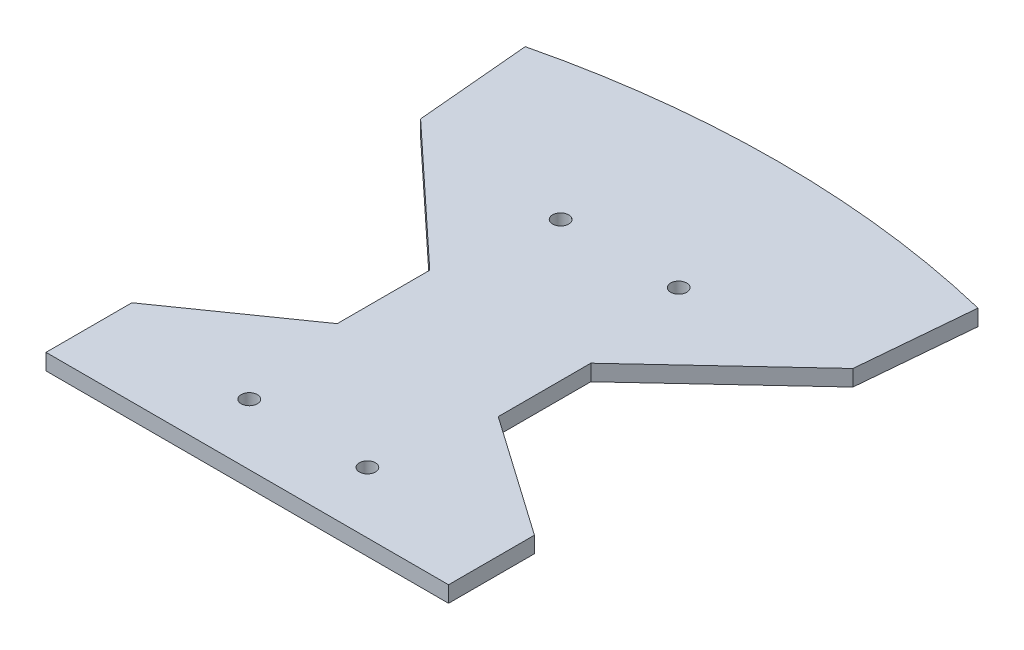
ISO-10303-21;
HEADER;
FILE_DESCRIPTION(('STEP AP214'),'2;1');
FILE_NAME('part.step','',(''),(''),'','','');
FILE_SCHEMA(('AUTOMOTIVE_DESIGN { 1 0 10303 214 1 1 1 1 }'));
ENDSEC;
DATA;
#1=APPLICATION_CONTEXT('core data for automotive mechanical design processes');
#2=APPLICATION_PROTOCOL_DEFINITION('international standard','automotive_design',2000,#1);
#3=PRODUCT_CONTEXT('',#1,'mechanical');
#4=PRODUCT('Part','Part','',(#3));
#5=PRODUCT_RELATED_PRODUCT_CATEGORY('part','',(#4));
#6=PRODUCT_DEFINITION_FORMATION('','',#4);
#7=PRODUCT_DEFINITION_CONTEXT('part definition',#1,'design');
#8=PRODUCT_DEFINITION('design','',#6,#7);
#9=PRODUCT_DEFINITION_SHAPE('','',#8);
#10=(LENGTH_UNIT() NAMED_UNIT(*) SI_UNIT(.MILLI.,.METRE.));
#11=(NAMED_UNIT(*) PLANE_ANGLE_UNIT() SI_UNIT($,.RADIAN.));
#12=(NAMED_UNIT(*) SI_UNIT($,.STERADIAN.) SOLID_ANGLE_UNIT());
#13=UNCERTAINTY_MEASURE_WITH_UNIT(LENGTH_MEASURE(1.E-05),#10,'distance_accuracy_value','');
#14=(GEOMETRIC_REPRESENTATION_CONTEXT(3) GLOBAL_UNCERTAINTY_ASSIGNED_CONTEXT((#13)) GLOBAL_UNIT_ASSIGNED_CONTEXT((#10,
#11,#12)) REPRESENTATION_CONTEXT('',''));
#15=CARTESIAN_POINT('',(0.,0.,0.));
#16=DIRECTION('',(0.,0.,1.));
#17=DIRECTION('',(1.,0.,0.));
#18=AXIS2_PLACEMENT_3D('',#15,#16,#17);
#19=CARTESIAN_POINT('',(0.,3.,-16.));
#20=DIRECTION('',(1.,0.,0.));
#21=DIRECTION('',(0.,0.,-1.));
#22=AXIS2_PLACEMENT_3D('',#19,#20,#21);
#23=PLANE('',#22);
#24=DIRECTION('',(0.,0.,1.));
#25=VECTOR('',#24,1.);
#26=CARTESIAN_POINT('',(0.,0.,-16.));
#27=LINE('',#26,#25);
#28=CARTESIAN_POINT('',(0.,0.,-16.));
#29=VERTEX_POINT('',#28);
#30=CARTESIAN_POINT('',(0.,0.,0.));
#31=VERTEX_POINT('',#30);
#32=EDGE_CURVE('E171',#29,#31,#27,.T.);
#33=ORIENTED_EDGE('',*,*,#32,.T.);
#34=DIRECTION('',(0.,-1.,0.));
#35=VECTOR('',#34,1.);
#36=CARTESIAN_POINT('',(0.,3.,0.));
#37=LINE('',#36,#35);
#38=CARTESIAN_POINT('',(0.,3.,0.));
#39=VERTEX_POINT('',#38);
#40=EDGE_CURVE('E11',#39,#31,#37,.T.);
#41=ORIENTED_EDGE('',*,*,#40,.F.);
#42=DIRECTION('',(0.,0.,1.));
#43=VECTOR('',#42,1.);
#44=CARTESIAN_POINT('',(0.,3.,-16.));
#45=LINE('',#44,#43);
#46=CARTESIAN_POINT('',(0.,3.,-16.));
#47=VERTEX_POINT('',#46);
#48=EDGE_CURVE('E208',#47,#39,#45,.T.);
#49=ORIENTED_EDGE('',*,*,#48,.F.);
#50=DIRECTION('',(0.,-1.,0.));
#51=VECTOR('',#50,1.);
#52=CARTESIAN_POINT('',(0.,3.,-16.));
#53=LINE('',#52,#51);
#54=EDGE_CURVE('E167',#47,#29,#53,.T.);
#55=ORIENTED_EDGE('',*,*,#54,.T.);
#56=EDGE_LOOP('',(#33,#41,#49,#55));
#57=FACE_BOUND('',#56,.T.);
#58=ADVANCED_FACE('F45',(#57),#23,.F.);
#59=CARTESIAN_POINT('',(0.,3.,0.));
#60=DIRECTION('',(0.,0.,-1.));
#61=DIRECTION('',(-1.,0.,0.));
#62=AXIS2_PLACEMENT_3D('',#59,#60,#61);
#63=PLANE('',#62);
#64=DIRECTION('',(1.,0.,0.));
#65=VECTOR('',#64,1.);
#66=CARTESIAN_POINT('',(0.,0.,0.));
#67=LINE('',#66,#65);
#68=CARTESIAN_POINT('',(75.,0.,0.));
#69=VERTEX_POINT('',#68);
#70=EDGE_CURVE('E175',#31,#69,#67,.T.);
#71=ORIENTED_EDGE('',*,*,#70,.T.);
#72=DIRECTION('',(0.,-1.,0.));
#73=VECTOR('',#72,1.);
#74=CARTESIAN_POINT('',(75.,3.,0.));
#75=LINE('',#74,#73);
#76=CARTESIAN_POINT('',(75.,3.,0.));
#77=VERTEX_POINT('',#76);
#78=EDGE_CURVE('E54',#77,#69,#75,.T.);
#79=ORIENTED_EDGE('',*,*,#78,.F.);
#80=DIRECTION('',(1.,0.,0.));
#81=VECTOR('',#80,1.);
#82=CARTESIAN_POINT('',(0.,3.,0.));
#83=LINE('',#82,#81);
#84=EDGE_CURVE('E115',#39,#77,#83,.T.);
#85=ORIENTED_EDGE('',*,*,#84,.F.);
#86=ORIENTED_EDGE('',*,*,#40,.T.);
#87=EDGE_LOOP('',(#71,#79,#85,#86));
#88=FACE_BOUND('',#87,.T.);
#89=ADVANCED_FACE('F351',(#88),#63,.F.);
#90=CARTESIAN_POINT('',(75.,3.,-16.));
#91=DIRECTION('',(-1.,0.,0.));
#92=DIRECTION('',(0.,0.,1.));
#93=AXIS2_PLACEMENT_3D('',#90,#91,#92);
#94=PLANE('',#93);
#95=DIRECTION('',(0.,0.,-1.));
#96=VECTOR('',#95,1.);
#97=CARTESIAN_POINT('',(75.,0.,-16.));
#98=LINE('',#97,#96);
#99=CARTESIAN_POINT('',(75.,0.,-16.));
#100=VERTEX_POINT('',#99);
#101=EDGE_CURVE('E179',#69,#100,#98,.T.);
#102=ORIENTED_EDGE('',*,*,#101,.T.);
#103=DIRECTION('',(0.,-1.,0.));
#104=VECTOR('',#103,1.);
#105=CARTESIAN_POINT('',(75.,3.,-16.));
#106=LINE('',#105,#104);
#107=CARTESIAN_POINT('',(75.,3.,-16.));
#108=VERTEX_POINT('',#107);
#109=EDGE_CURVE('E235',#108,#100,#106,.T.);
#110=ORIENTED_EDGE('',*,*,#109,.F.);
#111=DIRECTION('',(0.,0.,-1.));
#112=VECTOR('',#111,1.);
#113=CARTESIAN_POINT('',(75.,3.,-16.));
#114=LINE('',#113,#112);
#115=EDGE_CURVE('E245',#77,#108,#114,.T.);
#116=ORIENTED_EDGE('',*,*,#115,.F.);
#117=ORIENTED_EDGE('',*,*,#78,.T.);
#118=EDGE_LOOP('',(#102,#110,#116,#117));
#119=FACE_BOUND('',#118,.T.);
#120=ADVANCED_FACE('F243',(#119),#94,.F.);
#121=CARTESIAN_POINT('',(60.1756241456812,3.,-26.3801397224481));
#122=DIRECTION('',(-0.573576436351047,0.,0.819152044288991));
#123=DIRECTION('',(0.819152044288991,0.,0.573576436351047));
#124=AXIS2_PLACEMENT_3D('',#121,#122,#123);
#125=PLANE('',#124);
#126=DIRECTION('',(-0.819152044288991,0.,-0.573576436351047));
#127=VECTOR('',#126,1.);
#128=CARTESIAN_POINT('',(60.1756241456812,0.,-26.3801397224481));
#129=LINE('',#128,#127);
#130=CARTESIAN_POINT('',(52.5,0.,-31.7546696097185));
#131=VERTEX_POINT('',#130);
#132=EDGE_CURVE('E183',#100,#131,#129,.T.);
#133=ORIENTED_EDGE('',*,*,#132,.T.);
#134=DIRECTION('',(0.,-1.,0.));
#135=VECTOR('',#134,1.);
#136=CARTESIAN_POINT('',(52.5,3.,-31.7546696097185));
#137=LINE('',#136,#135);
#138=CARTESIAN_POINT('',(52.5,3.,-31.7546696097185));
#139=VERTEX_POINT('',#138);
#140=EDGE_CURVE('E231',#139,#131,#137,.T.);
#141=ORIENTED_EDGE('',*,*,#140,.F.);
#142=DIRECTION('',(-0.819152044288991,0.,-0.573576436351048));
#143=VECTOR('',#142,1.);
#144=CARTESIAN_POINT('',(75.,3.,-16.));
#145=LINE('',#144,#143);
#146=EDGE_CURVE('E261',#108,#139,#145,.T.);
#147=ORIENTED_EDGE('',*,*,#146,.F.);
#148=ORIENTED_EDGE('',*,*,#109,.T.);
#149=EDGE_LOOP('',(#133,#141,#147,#148));
#150=FACE_BOUND('',#149,.T.);
#151=ADVANCED_FACE('F251',(#150),#125,.F.);
#152=CARTESIAN_POINT('',(52.5,3.,-31.7546696097185));
#153=DIRECTION('',(-1.,0.,0.));
#154=DIRECTION('',(0.,0.,1.));
#155=AXIS2_PLACEMENT_3D('',#152,#153,#154);
#156=PLANE('',#155);
#157=DIRECTION('',(0.,0.,-1.));
#158=VECTOR('',#157,1.);
#159=CARTESIAN_POINT('',(52.5,0.,-31.7546696097185));
#160=LINE('',#159,#158);
#161=CARTESIAN_POINT('',(52.5,0.,-49.0000000000003));
#162=VERTEX_POINT('',#161);
#163=EDGE_CURVE('E186',#131,#162,#160,.T.);
#164=ORIENTED_EDGE('',*,*,#163,.T.);
#165=DIRECTION('',(0.,-1.,0.));
#166=VECTOR('',#165,1.);
#167=CARTESIAN_POINT('',(52.5,3.,-49.0000000000003));
#168=LINE('',#167,#166);
#169=CARTESIAN_POINT('',(52.5,3.,-49.0000000000003));
#170=VERTEX_POINT('',#169);
#171=EDGE_CURVE('E227',#170,#162,#168,.T.);
#172=ORIENTED_EDGE('',*,*,#171,.F.);
#173=DIRECTION('',(0.,0.,-1.));
#174=VECTOR('',#173,1.);
#175=CARTESIAN_POINT('',(52.5,3.,-31.7546696097185));
#176=LINE('',#175,#174);
#177=EDGE_CURVE('E257',#139,#170,#176,.T.);
#178=ORIENTED_EDGE('',*,*,#177,.F.);
#179=ORIENTED_EDGE('',*,*,#140,.T.);
#180=EDGE_LOOP('',(#164,#172,#178,#179));
#181=FACE_BOUND('',#180,.T.);
#182=ADVANCED_FACE('F255',(#181),#156,.F.);
#183=CARTESIAN_POINT('',(77.7746986449188,3.,-72.5644731748809));
#184=DIRECTION('',(-0.681927702495492,0.,-0.73141958448569));
#185=DIRECTION('',(-0.73141958448569,0.,0.681927702495492));
#186=AXIS2_PLACEMENT_3D('',#183,#184,#185);
#187=PLANE('',#186);
#188=DIRECTION('',(0.73141958448569,0.,-0.681927702495493));
#189=VECTOR('',#188,1.);
#190=CARTESIAN_POINT('',(77.7746986449188,0.,-72.5644731748809));
#191=LINE('',#190,#189);
#192=CARTESIAN_POINT('',(77.7746986449188,0.,-72.5644731748809));
#193=VERTEX_POINT('',#192);
#194=EDGE_CURVE('E189',#162,#193,#191,.T.);
#195=ORIENTED_EDGE('',*,*,#194,.T.);
#196=DIRECTION('',(0.,-1.,0.));
#197=VECTOR('',#196,1.);
#198=CARTESIAN_POINT('',(77.7746986449188,3.,-72.5644731748809));
#199=LINE('',#198,#197);
#200=CARTESIAN_POINT('',(77.7746986449188,3.,-72.5644731748809));
#201=VERTEX_POINT('',#200);
#202=EDGE_CURVE('E223',#201,#193,#199,.T.);
#203=ORIENTED_EDGE('',*,*,#202,.F.);
#204=DIRECTION('',(0.73141958448569,0.,-0.681927702495493));
#205=VECTOR('',#204,1.);
#206=CARTESIAN_POINT('',(77.7746986449188,3.,-72.5644731748809));
#207=LINE('',#206,#205);
#208=EDGE_CURVE('E260',#170,#201,#207,.T.);
#209=ORIENTED_EDGE('',*,*,#208,.F.);
#210=ORIENTED_EDGE('',*,*,#171,.T.);
#211=EDGE_LOOP('',(#195,#203,#209,#210));
#212=FACE_BOUND('',#211,.T.);
#213=ADVANCED_FACE('F364',(#212),#187,.F.);
#214=CARTESIAN_POINT('',(79.6781609195403,3.,-93.9597733427052));
#215=DIRECTION('',(-0.99606583106991,0.,-0.088616365164737));
#216=DIRECTION('',(-0.088616365164737,0.,0.99606583106991));
#217=AXIS2_PLACEMENT_3D('',#214,#215,#216);
#218=PLANE('',#217);
#219=DIRECTION('',(0.088616365164737,0.,-0.99606583106991));
#220=VECTOR('',#219,1.);
#221=CARTESIAN_POINT('',(79.6781609195403,0.,-93.9597733427052));
#222=LINE('',#221,#220);
#223=CARTESIAN_POINT('',(79.6781609195403,0.,-93.9597733427052));
#224=VERTEX_POINT('',#223);
#225=EDGE_CURVE('E192',#193,#224,#222,.T.);
#226=ORIENTED_EDGE('',*,*,#225,.T.);
#227=DIRECTION('',(0.,-1.,0.));
#228=VECTOR('',#227,1.);
#229=CARTESIAN_POINT('',(79.6781609195403,3.,-93.9597733427052));
#230=LINE('',#229,#228);
#231=CARTESIAN_POINT('',(79.6781609195403,3.,-93.9597733427052));
#232=VERTEX_POINT('',#231);
#233=EDGE_CURVE('E219',#232,#224,#230,.T.);
#234=ORIENTED_EDGE('',*,*,#233,.F.);
#235=DIRECTION('',(0.088616365164737,0.,-0.99606583106991));
#236=VECTOR('',#235,1.);
#237=CARTESIAN_POINT('',(79.6781609195403,3.,-93.9597733427052));
#238=LINE('',#237,#236);
#239=EDGE_CURVE('E265',#201,#232,#238,.T.);
#240=ORIENTED_EDGE('',*,*,#239,.F.);
#241=ORIENTED_EDGE('',*,*,#202,.T.);
#242=EDGE_LOOP('',(#226,#234,#240,#241));
#243=FACE_BOUND('',#242,.T.);
#244=ADVANCED_FACE('F367',(#243),#218,.F.);
#245=CARTESIAN_POINT('',(37.5,3.,80.));
#246=DIRECTION('',(0.,-1.,0.));
#247=DIRECTION('',(0.,0.,-1.));
#248=AXIS2_PLACEMENT_3D('',#245,#246,#247);
#249=CYLINDRICAL_SURFACE('',#248,179.);
#250=CARTESIAN_POINT('',(37.5,0.,80.));
#251=DIRECTION('',(0.,1.,0.));
#252=DIRECTION('',(0.,0.,1.));
#253=AXIS2_PLACEMENT_3D('',#250,#251,#252);
#254=CIRCLE('',#253,179.);
#255=CARTESIAN_POINT('',(-4.67816091954023,0.,-93.9597733427052));
#256=VERTEX_POINT('',#255);
#257=EDGE_CURVE('E195',#224,#256,#254,.T.);
#258=ORIENTED_EDGE('',*,*,#257,.T.);
#259=DIRECTION('',(0.,-1.,0.));
#260=VECTOR('',#259,1.);
#261=CARTESIAN_POINT('',(-4.67816091954023,3.,-93.9597733427052));
#262=LINE('',#261,#260);
#263=CARTESIAN_POINT('',(-4.67816091954023,3.,-93.9597733427052));
#264=VERTEX_POINT('',#263);
#265=EDGE_CURVE('E215',#264,#256,#262,.T.);
#266=ORIENTED_EDGE('',*,*,#265,.F.);
#267=CARTESIAN_POINT('',(37.5,3.,80.));
#268=DIRECTION('',(0.,1.,0.));
#269=DIRECTION('',(0.,0.,1.));
#270=AXIS2_PLACEMENT_3D('',#267,#268,#269);
#271=CIRCLE('',#270,179.);
#272=EDGE_CURVE('E272',#232,#264,#271,.T.);
#273=ORIENTED_EDGE('',*,*,#272,.F.);
#274=ORIENTED_EDGE('',*,*,#233,.T.);
#275=EDGE_LOOP('',(#258,#266,#273,#274));
#276=FACE_BOUND('',#275,.T.);
#277=ADVANCED_FACE('F280',(#276),#249,.T.);
#278=CARTESIAN_POINT('',(-4.67816091954024,3.,-93.9597733427052));
#279=DIRECTION('',(0.99606583106991,0.,-0.0886163651647363));
#280=DIRECTION('',(-0.0886163651647364,0.,-0.99606583106991));
#281=AXIS2_PLACEMENT_3D('',#278,#279,#280);
#282=PLANE('',#281);
#283=DIRECTION('',(0.0886163651647364,0.,0.99606583106991));
#284=VECTOR('',#283,1.);
#285=CARTESIAN_POINT('',(-4.67816091954024,0.,-93.9597733427052));
#286=LINE('',#285,#284);
#287=CARTESIAN_POINT('',(-2.77469864491877,0.,-72.5644731748809));
#288=VERTEX_POINT('',#287);
#289=EDGE_CURVE('E198',#256,#288,#286,.T.);
#290=ORIENTED_EDGE('',*,*,#289,.T.);
#291=DIRECTION('',(0.,-1.,0.));
#292=VECTOR('',#291,1.);
#293=CARTESIAN_POINT('',(-2.77469864491877,3.,-72.5644731748809));
#294=LINE('',#293,#292);
#295=CARTESIAN_POINT('',(-2.77469864491877,3.,-72.5644731748809));
#296=VERTEX_POINT('',#295);
#297=EDGE_CURVE('E160',#296,#288,#294,.T.);
#298=ORIENTED_EDGE('',*,*,#297,.F.);
#299=DIRECTION('',(0.0886163651647364,0.,0.99606583106991));
#300=VECTOR('',#299,1.);
#301=CARTESIAN_POINT('',(-4.67816091954024,3.,-93.9597733427052));
#302=LINE('',#301,#300);
#303=EDGE_CURVE('E147',#264,#296,#302,.T.);
#304=ORIENTED_EDGE('',*,*,#303,.F.);
#305=ORIENTED_EDGE('',*,*,#265,.T.);
#306=EDGE_LOOP('',(#290,#298,#304,#305));
#307=FACE_BOUND('',#306,.T.);
#308=ADVANCED_FACE('F284',(#307),#282,.F.);
#309=CARTESIAN_POINT('',(-2.77469864491877,3.,-72.5644731748809));
#310=DIRECTION('',(0.681927702495493,0.,-0.73141958448569));
#311=DIRECTION('',(-0.73141958448569,0.,-0.681927702495493));
#312=AXIS2_PLACEMENT_3D('',#309,#310,#311);
#313=PLANE('',#312);
#314=DIRECTION('',(0.73141958448569,0.,0.681927702495493));
#315=VECTOR('',#314,1.);
#316=CARTESIAN_POINT('',(-2.77469864491877,0.,-72.5644731748809));
#317=LINE('',#316,#315);
#318=CARTESIAN_POINT('',(22.5,0.,-49.0000000000003));
#319=VERTEX_POINT('',#318);
#320=EDGE_CURVE('E157',#288,#319,#317,.T.);
#321=ORIENTED_EDGE('',*,*,#320,.T.);
#322=DIRECTION('',(0.,-1.,0.));
#323=VECTOR('',#322,1.);
#324=CARTESIAN_POINT('',(22.5,3.,-49.0000000000003));
#325=LINE('',#324,#323);
#326=CARTESIAN_POINT('',(22.5,3.,-49.0000000000003));
#327=VERTEX_POINT('',#326);
#328=EDGE_CURVE('E154',#327,#319,#325,.T.);
#329=ORIENTED_EDGE('',*,*,#328,.F.);
#330=DIRECTION('',(0.73141958448569,0.,0.681927702495493));
#331=VECTOR('',#330,1.);
#332=CARTESIAN_POINT('',(-2.77469864491877,3.,-72.5644731748809));
#333=LINE('',#332,#331);
#334=EDGE_CURVE('E140',#296,#327,#333,.T.);
#335=ORIENTED_EDGE('',*,*,#334,.F.);
#336=ORIENTED_EDGE('',*,*,#297,.T.);
#337=EDGE_LOOP('',(#321,#329,#335,#336));
#338=FACE_BOUND('',#337,.T.);
#339=ADVANCED_FACE('F155',(#338),#313,.F.);
#340=CARTESIAN_POINT('',(22.5,3.,-31.7546696097185));
#341=DIRECTION('',(1.,0.,0.));
#342=DIRECTION('',(0.,0.,-1.));
#343=AXIS2_PLACEMENT_3D('',#340,#341,#342);
#344=PLANE('',#343);
#345=DIRECTION('',(0.,0.,1.));
#346=VECTOR('',#345,1.);
#347=CARTESIAN_POINT('',(22.5,0.,-31.7546696097185));
#348=LINE('',#347,#346);
#349=CARTESIAN_POINT('',(22.5,0.,-31.7546696097185));
#350=VERTEX_POINT('',#349);
#351=EDGE_CURVE('E203',#319,#350,#348,.T.);
#352=ORIENTED_EDGE('',*,*,#351,.T.);
#353=DIRECTION('',(0.,-1.,0.));
#354=VECTOR('',#353,1.);
#355=CARTESIAN_POINT('',(22.5,3.,-31.7546696097185));
#356=LINE('',#355,#354);
#357=CARTESIAN_POINT('',(22.5,3.,-31.7546696097185));
#358=VERTEX_POINT('',#357);
#359=EDGE_CURVE('E161',#358,#350,#356,.T.);
#360=ORIENTED_EDGE('',*,*,#359,.F.);
#361=DIRECTION('',(0.,0.,1.));
#362=VECTOR('',#361,1.);
#363=CARTESIAN_POINT('',(22.5,3.,-31.7546696097185));
#364=LINE('',#363,#362);
#365=EDGE_CURVE('E144',#327,#358,#364,.T.);
#366=ORIENTED_EDGE('',*,*,#365,.F.);
#367=ORIENTED_EDGE('',*,*,#328,.T.);
#368=EDGE_LOOP('',(#352,#360,#366,#367));
#369=FACE_BOUND('',#368,.T.);
#370=ADVANCED_FACE('F163',(#369),#344,.F.);
#371=CARTESIAN_POINT('',(0.,3.,-16.));
#372=DIRECTION('',(0.573576436351047,0.,0.819152044288991));
#373=DIRECTION('',(0.819152044288991,0.,-0.573576436351047));
#374=AXIS2_PLACEMENT_3D('',#371,#372,#373);
#375=PLANE('',#374);
#376=DIRECTION('',(-0.819152044288991,0.,0.573576436351047));
#377=VECTOR('',#376,1.);
#378=CARTESIAN_POINT('',(0.,0.,-16.));
#379=LINE('',#378,#377);
#380=EDGE_CURVE('E103',#350,#29,#379,.T.);
#381=ORIENTED_EDGE('',*,*,#380,.T.);
#382=ORIENTED_EDGE('',*,*,#54,.F.);
#383=DIRECTION('',(-0.819152044288991,0.,0.573576436351047));
#384=VECTOR('',#383,1.);
#385=CARTESIAN_POINT('',(14.8243758543188,3.,-26.3801397224481));
#386=LINE('',#385,#384);
#387=EDGE_CURVE('E62',#358,#47,#386,.T.);
#388=ORIENTED_EDGE('',*,*,#387,.F.);
#389=ORIENTED_EDGE('',*,*,#359,.T.);
#390=EDGE_LOOP('',(#381,#382,#388,#389));
#391=FACE_BOUND('',#390,.T.);
#392=ADVANCED_FACE('F285',(#391),#375,.F.);
#393=CARTESIAN_POINT('',(37.5,3.,80.));
#394=DIRECTION('',(0.,1.,0.));
#395=DIRECTION('',(0.,0.,1.));
#396=AXIS2_PLACEMENT_3D('',#393,#394,#395);
#397=PLANE('',#396);
#398=CARTESIAN_POINT('',(26.5,3.,-11.3773348048594));
#399=DIRECTION('',(0.,1.,0.));
#400=DIRECTION('',(0.,0.,-1.));
#401=AXIS2_PLACEMENT_3D('',#398,#399,#400);
#402=CIRCLE('',#401,1.5);
#403=CARTESIAN_POINT('',(26.5,3.,-12.8773348048594));
#404=VERTEX_POINT('',#403);
#405=EDGE_CURVE('E307',#404,#404,#402,.T.);
#406=ORIENTED_EDGE('',*,*,#405,.F.);
#407=EDGE_LOOP('',(#406));
#408=FACE_BOUND('',#407,.T.);
#409=CARTESIAN_POINT('',(48.5,3.,-11.3773348048594));
#410=DIRECTION('',(0.,1.,0.));
#411=DIRECTION('',(0.,0.,1.));
#412=AXIS2_PLACEMENT_3D('',#409,#410,#411);
#413=CIRCLE('',#412,1.5);
#414=CARTESIAN_POINT('',(48.5,3.,-9.87733480485941));
#415=VERTEX_POINT('',#414);
#416=EDGE_CURVE('E315',#415,#415,#413,.T.);
#417=ORIENTED_EDGE('',*,*,#416,.F.);
#418=EDGE_LOOP('',(#417));
#419=FACE_BOUND('',#418,.T.);
#420=CARTESIAN_POINT('',(48.5,3.,-69.3773348048594));
#421=DIRECTION('',(0.,1.,0.));
#422=DIRECTION('',(0.,0.,-1.));
#423=AXIS2_PLACEMENT_3D('',#420,#421,#422);
#424=CIRCLE('',#423,1.5);
#425=CARTESIAN_POINT('',(48.5,3.,-70.8773348048594));
#426=VERTEX_POINT('',#425);
#427=EDGE_CURVE('E299',#426,#426,#424,.T.);
#428=ORIENTED_EDGE('',*,*,#427,.F.);
#429=EDGE_LOOP('',(#428));
#430=FACE_BOUND('',#429,.T.);
#431=CARTESIAN_POINT('',(26.5,3.,-69.3773348048594));
#432=DIRECTION('',(0.,1.,0.));
#433=DIRECTION('',(0.,0.,1.));
#434=AXIS2_PLACEMENT_3D('',#431,#432,#433);
#435=CIRCLE('',#434,1.5);
#436=CARTESIAN_POINT('',(26.5,3.,-67.8773348048594));
#437=VERTEX_POINT('',#436);
#438=EDGE_CURVE('E294',#437,#437,#435,.T.);
#439=ORIENTED_EDGE('',*,*,#438,.F.);
#440=EDGE_LOOP('',(#439));
#441=FACE_BOUND('',#440,.T.);
#442=ORIENTED_EDGE('',*,*,#48,.T.);
#443=ORIENTED_EDGE('',*,*,#84,.T.);
#444=ORIENTED_EDGE('',*,*,#115,.T.);
#445=ORIENTED_EDGE('',*,*,#146,.T.);
#446=ORIENTED_EDGE('',*,*,#177,.T.);
#447=ORIENTED_EDGE('',*,*,#208,.T.);
#448=ORIENTED_EDGE('',*,*,#239,.T.);
#449=ORIENTED_EDGE('',*,*,#272,.T.);
#450=ORIENTED_EDGE('',*,*,#303,.T.);
#451=ORIENTED_EDGE('',*,*,#334,.T.);
#452=ORIENTED_EDGE('',*,*,#365,.T.);
#453=ORIENTED_EDGE('',*,*,#387,.T.);
#454=EDGE_LOOP('',(#442,#443,#444,#445,#446,#447,#448,#449,#450,#451,#452,#453));
#455=FACE_BOUND('',#454,.T.);
#456=ADVANCED_FACE('F142',(#408,#419,#430,#441,#455),#397,.T.);
#457=CARTESIAN_POINT('',(37.5,0.,80.));
#458=DIRECTION('',(0.,1.,0.));
#459=DIRECTION('',(0.,0.,1.));
#460=AXIS2_PLACEMENT_3D('',#457,#458,#459);
#461=PLANE('',#460);
#462=CARTESIAN_POINT('',(26.5,0.,-11.3773348048594));
#463=DIRECTION('',(0.,1.,0.));
#464=DIRECTION('',(0.,0.,-1.));
#465=AXIS2_PLACEMENT_3D('',#462,#463,#464);
#466=CIRCLE('',#465,1.5);
#467=CARTESIAN_POINT('',(26.5,0.,-12.8773348048594));
#468=VERTEX_POINT('',#467);
#469=EDGE_CURVE('E303',#468,#468,#466,.T.);
#470=ORIENTED_EDGE('',*,*,#469,.T.);
#471=EDGE_LOOP('',(#470));
#472=FACE_BOUND('',#471,.T.);
#473=CARTESIAN_POINT('',(48.5,0.,-11.3773348048594));
#474=DIRECTION('',(0.,1.,0.));
#475=DIRECTION('',(0.,0.,1.));
#476=AXIS2_PLACEMENT_3D('',#473,#474,#475);
#477=CIRCLE('',#476,1.5);
#478=CARTESIAN_POINT('',(48.5,0.,-9.87733480485941));
#479=VERTEX_POINT('',#478);
#480=EDGE_CURVE('E311',#479,#479,#477,.T.);
#481=ORIENTED_EDGE('',*,*,#480,.T.);
#482=EDGE_LOOP('',(#481));
#483=FACE_BOUND('',#482,.T.);
#484=CARTESIAN_POINT('',(48.5,0.,-69.3773348048594));
#485=DIRECTION('',(0.,1.,0.));
#486=DIRECTION('',(0.,0.,-1.));
#487=AXIS2_PLACEMENT_3D('',#484,#485,#486);
#488=CIRCLE('',#487,1.5);
#489=CARTESIAN_POINT('',(48.5,0.,-70.8773348048594));
#490=VERTEX_POINT('',#489);
#491=EDGE_CURVE('E319',#490,#490,#488,.T.);
#492=ORIENTED_EDGE('',*,*,#491,.T.);
#493=EDGE_LOOP('',(#492));
#494=FACE_BOUND('',#493,.T.);
#495=CARTESIAN_POINT('',(26.5,0.,-69.3773348048594));
#496=DIRECTION('',(0.,1.,0.));
#497=DIRECTION('',(0.,0.,1.));
#498=AXIS2_PLACEMENT_3D('',#495,#496,#497);
#499=CIRCLE('',#498,1.5);
#500=CARTESIAN_POINT('',(26.5,0.,-67.8773348048594));
#501=VERTEX_POINT('',#500);
#502=EDGE_CURVE('E176',#501,#501,#499,.T.);
#503=ORIENTED_EDGE('',*,*,#502,.T.);
#504=EDGE_LOOP('',(#503));
#505=FACE_BOUND('',#504,.T.);
#506=ORIENTED_EDGE('',*,*,#32,.F.);
#507=ORIENTED_EDGE('',*,*,#380,.F.);
#508=ORIENTED_EDGE('',*,*,#351,.F.);
#509=ORIENTED_EDGE('',*,*,#320,.F.);
#510=ORIENTED_EDGE('',*,*,#289,.F.);
#511=ORIENTED_EDGE('',*,*,#257,.F.);
#512=ORIENTED_EDGE('',*,*,#225,.F.);
#513=ORIENTED_EDGE('',*,*,#194,.F.);
#514=ORIENTED_EDGE('',*,*,#163,.F.);
#515=ORIENTED_EDGE('',*,*,#132,.F.);
#516=ORIENTED_EDGE('',*,*,#101,.F.);
#517=ORIENTED_EDGE('',*,*,#70,.F.);
#518=EDGE_LOOP('',(#506,#507,#508,#509,#510,#511,#512,#513,#514,#515,#516,#517));
#519=FACE_BOUND('',#518,.T.);
#520=ADVANCED_FACE('F246',(#472,#483,#494,#505,#519),#461,.F.);
#521=CARTESIAN_POINT('',(26.5,0.,-69.3773348048594));
#522=DIRECTION('',(0.,1.,0.));
#523=DIRECTION('',(0.,0.,1.));
#524=AXIS2_PLACEMENT_3D('',#521,#522,#523);
#525=CYLINDRICAL_SURFACE('',#524,1.5);
#526=ORIENTED_EDGE('',*,*,#502,.F.);
#527=EDGE_LOOP('',(#526));
#528=FACE_BOUND('',#527,.T.);
#529=ORIENTED_EDGE('',*,*,#438,.T.);
#530=EDGE_LOOP('',(#529));
#531=FACE_BOUND('',#530,.T.);
#532=ADVANCED_FACE('F335',(#528,#531),#525,.F.);
#533=CARTESIAN_POINT('',(48.5,0.,-69.3773348048594));
#534=DIRECTION('',(0.,1.,0.));
#535=DIRECTION('',(0.,0.,1.));
#536=AXIS2_PLACEMENT_3D('',#533,#534,#535);
#537=CYLINDRICAL_SURFACE('',#536,1.5);
#538=ORIENTED_EDGE('',*,*,#491,.F.);
#539=EDGE_LOOP('',(#538));
#540=FACE_BOUND('',#539,.T.);
#541=ORIENTED_EDGE('',*,*,#427,.T.);
#542=EDGE_LOOP('',(#541));
#543=FACE_BOUND('',#542,.T.);
#544=ADVANCED_FACE('F327',(#540,#543),#537,.F.);
#545=CARTESIAN_POINT('',(48.5,0.,-11.3773348048594));
#546=DIRECTION('',(0.,1.,0.));
#547=DIRECTION('',(0.,0.,1.));
#548=AXIS2_PLACEMENT_3D('',#545,#546,#547);
#549=CYLINDRICAL_SURFACE('',#548,1.5);
#550=ORIENTED_EDGE('',*,*,#480,.F.);
#551=EDGE_LOOP('',(#550));
#552=FACE_BOUND('',#551,.T.);
#553=ORIENTED_EDGE('',*,*,#416,.T.);
#554=EDGE_LOOP('',(#553));
#555=FACE_BOUND('',#554,.T.);
#556=ADVANCED_FACE('F343',(#552,#555),#549,.F.);
#557=CARTESIAN_POINT('',(26.5,0.,-11.3773348048594));
#558=DIRECTION('',(0.,1.,0.));
#559=DIRECTION('',(0.,0.,1.));
#560=AXIS2_PLACEMENT_3D('',#557,#558,#559);
#561=CYLINDRICAL_SURFACE('',#560,1.5);
#562=ORIENTED_EDGE('',*,*,#469,.F.);
#563=EDGE_LOOP('',(#562));
#564=FACE_BOUND('',#563,.T.);
#565=ORIENTED_EDGE('',*,*,#405,.T.);
#566=EDGE_LOOP('',(#565));
#567=FACE_BOUND('',#566,.T.);
#568=ADVANCED_FACE('F415',(#564,#567),#561,.F.);
#569=CLOSED_SHELL('',(#58,#89,#120,#151,#182,#213,#244,#277,#308,#339,#370,#392,#456,#520,#532,
#544,#556,#568));
#570=MANIFOLD_SOLID_BREP('B2',#569);
#571=ADVANCED_BREP_SHAPE_REPRESENTATION('',(#18,#570),#14);
#572=SHAPE_DEFINITION_REPRESENTATION(#9,#571);
ENDSEC;
END-ISO-10303-21;
